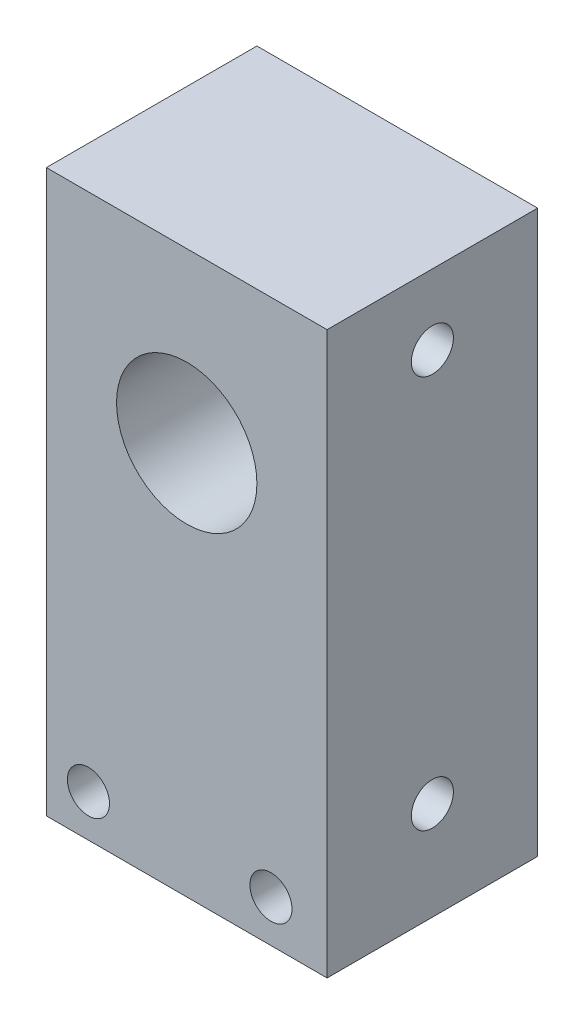
ISO-10303-21;
HEADER;
FILE_DESCRIPTION(('STEP AP214'),'2;1');
FILE_NAME('part.step','',(''),(''),'','','');
FILE_SCHEMA(('AUTOMOTIVE_DESIGN { 1 0 10303 214 1 1 1 1 }'));
ENDSEC;
DATA;
#1=APPLICATION_CONTEXT('core data for automotive mechanical design processes');
#2=APPLICATION_PROTOCOL_DEFINITION('international standard','automotive_design',2000,#1);
#3=PRODUCT_CONTEXT('',#1,'mechanical');
#4=PRODUCT('Part','Part','',(#3));
#5=PRODUCT_RELATED_PRODUCT_CATEGORY('part','',(#4));
#6=PRODUCT_DEFINITION_FORMATION('','',#4);
#7=PRODUCT_DEFINITION_CONTEXT('part definition',#1,'design');
#8=PRODUCT_DEFINITION('design','',#6,#7);
#9=PRODUCT_DEFINITION_SHAPE('','',#8);
#10=(LENGTH_UNIT() NAMED_UNIT(*) SI_UNIT(.MILLI.,.METRE.));
#11=(NAMED_UNIT(*) PLANE_ANGLE_UNIT() SI_UNIT($,.RADIAN.));
#12=(NAMED_UNIT(*) SI_UNIT($,.STERADIAN.) SOLID_ANGLE_UNIT());
#13=UNCERTAINTY_MEASURE_WITH_UNIT(LENGTH_MEASURE(1.E-05),#10,'distance_accuracy_value','');
#14=(GEOMETRIC_REPRESENTATION_CONTEXT(3) GLOBAL_UNCERTAINTY_ASSIGNED_CONTEXT((#13)) GLOBAL_UNIT_ASSIGNED_CONTEXT((#10,
#11,#12)) REPRESENTATION_CONTEXT('',''));
#15=CARTESIAN_POINT('',(0.,0.,0.));
#16=DIRECTION('',(0.,0.,1.));
#17=DIRECTION('',(1.,0.,0.));
#18=AXIS2_PLACEMENT_3D('',#15,#16,#17);
#19=CARTESIAN_POINT('',(0.,0.,15.));
#20=DIRECTION('',(1.,0.,0.));
#21=DIRECTION('',(0.,1.,0.));
#22=AXIS2_PLACEMENT_3D('',#19,#20,#21);
#23=PLANE('',#22);
#24=DIRECTION('',(0.,-1.,0.));
#25=VECTOR('',#24,1.);
#26=CARTESIAN_POINT('',(0.,0.,0.));
#27=LINE('',#26,#25);
#28=CARTESIAN_POINT('',(0.,40.,0.));
#29=VERTEX_POINT('',#28);
#30=CARTESIAN_POINT('',(0.,0.,0.));
#31=VERTEX_POINT('',#30);
#32=EDGE_CURVE('E121',#29,#31,#27,.T.);
#33=ORIENTED_EDGE('',*,*,#32,.T.);
#34=DIRECTION('',(0.,0.,-1.));
#35=VECTOR('',#34,1.);
#36=CARTESIAN_POINT('',(0.,0.,15.));
#37=LINE('',#36,#35);
#38=CARTESIAN_POINT('',(0.,0.,15.));
#39=VERTEX_POINT('',#38);
#40=EDGE_CURVE('E13',#39,#31,#37,.T.);
#41=ORIENTED_EDGE('',*,*,#40,.F.);
#42=DIRECTION('',(0.,-1.,0.));
#43=VECTOR('',#42,1.);
#44=CARTESIAN_POINT('',(0.,0.,15.));
#45=LINE('',#44,#43);
#46=CARTESIAN_POINT('',(0.,40.,15.));
#47=VERTEX_POINT('',#46);
#48=EDGE_CURVE('E104',#47,#39,#45,.T.);
#49=ORIENTED_EDGE('',*,*,#48,.F.);
#50=DIRECTION('',(0.,0.,-1.));
#51=VECTOR('',#50,1.);
#52=CARTESIAN_POINT('',(0.,40.,15.));
#53=LINE('',#52,#51);
#54=EDGE_CURVE('E117',#47,#29,#53,.T.);
#55=ORIENTED_EDGE('',*,*,#54,.T.);
#56=EDGE_LOOP('',(#33,#41,#49,#55));
#57=FACE_BOUND('',#56,.T.);
#58=ADVANCED_FACE('F52',(#57),#23,.F.);
#59=CARTESIAN_POINT('',(0.,0.,15.));
#60=DIRECTION('',(0.,1.,0.));
#61=DIRECTION('',(0.,0.,1.));
#62=AXIS2_PLACEMENT_3D('',#59,#60,#61);
#63=PLANE('',#62);
#64=DIRECTION('',(1.,0.,0.));
#65=VECTOR('',#64,1.);
#66=CARTESIAN_POINT('',(0.,0.,0.));
#67=LINE('',#66,#65);
#68=CARTESIAN_POINT('',(20.,0.,0.));
#69=VERTEX_POINT('',#68);
#70=EDGE_CURVE('E109',#31,#69,#67,.T.);
#71=ORIENTED_EDGE('',*,*,#70,.T.);
#72=DIRECTION('',(0.,0.,-1.));
#73=VECTOR('',#72,1.);
#74=CARTESIAN_POINT('',(20.,0.,15.));
#75=LINE('',#74,#73);
#76=CARTESIAN_POINT('',(20.,0.,15.));
#77=VERTEX_POINT('',#76);
#78=EDGE_CURVE('E61',#77,#69,#75,.T.);
#79=ORIENTED_EDGE('',*,*,#78,.F.);
#80=DIRECTION('',(1.,0.,0.));
#81=VECTOR('',#80,1.);
#82=CARTESIAN_POINT('',(0.,0.,15.));
#83=LINE('',#82,#81);
#84=EDGE_CURVE('E99',#39,#77,#83,.T.);
#85=ORIENTED_EDGE('',*,*,#84,.F.);
#86=ORIENTED_EDGE('',*,*,#40,.T.);
#87=EDGE_LOOP('',(#71,#79,#85,#86));
#88=FACE_BOUND('',#87,.T.);
#89=ADVANCED_FACE('F108',(#88),#63,.F.);
#90=CARTESIAN_POINT('',(20.,0.,15.));
#91=DIRECTION('',(-1.,0.,0.));
#92=DIRECTION('',(0.,-1.,0.));
#93=AXIS2_PLACEMENT_3D('',#90,#91,#92);
#94=PLANE('',#93);
#95=CARTESIAN_POINT('',(20.,35.,7.50000000000001));
#96=DIRECTION('',(1.,0.,0.));
#97=DIRECTION('',(0.,1.,0.));
#98=AXIS2_PLACEMENT_3D('',#95,#96,#97);
#99=CIRCLE('',#98,1.5);
#100=CARTESIAN_POINT('',(20.,36.5,7.50000000000001));
#101=VERTEX_POINT('',#100);
#102=EDGE_CURVE('E153',#101,#101,#99,.T.);
#103=ORIENTED_EDGE('',*,*,#102,.F.);
#104=EDGE_LOOP('',(#103));
#105=FACE_BOUND('',#104,.T.);
#106=CARTESIAN_POINT('',(19.9999999999999,7.00000000000001,7.50000000000001));
#107=DIRECTION('',(1.,0.,0.));
#108=DIRECTION('',(0.,1.,0.));
#109=AXIS2_PLACEMENT_3D('',#106,#107,#108);
#110=CIRCLE('',#109,1.5);
#111=CARTESIAN_POINT('',(19.9999999999999,8.50000000000001,7.50000000000001));
#112=VERTEX_POINT('',#111);
#113=EDGE_CURVE('E144',#112,#112,#110,.T.);
#114=ORIENTED_EDGE('',*,*,#113,.F.);
#115=EDGE_LOOP('',(#114));
#116=FACE_BOUND('',#115,.T.);
#117=DIRECTION('',(0.,1.,0.));
#118=VECTOR('',#117,1.);
#119=CARTESIAN_POINT('',(20.,0.,0.));
#120=LINE('',#119,#118);
#121=CARTESIAN_POINT('',(20.,40.,0.));
#122=VERTEX_POINT('',#121);
#123=EDGE_CURVE('E86',#69,#122,#120,.T.);
#124=ORIENTED_EDGE('',*,*,#123,.T.);
#125=DIRECTION('',(0.,0.,-1.));
#126=VECTOR('',#125,1.);
#127=CARTESIAN_POINT('',(20.,40.,15.));
#128=LINE('',#127,#126);
#129=CARTESIAN_POINT('',(20.,40.,15.));
#130=VERTEX_POINT('',#129);
#131=EDGE_CURVE('E111',#130,#122,#128,.T.);
#132=ORIENTED_EDGE('',*,*,#131,.F.);
#133=DIRECTION('',(0.,1.,0.));
#134=VECTOR('',#133,1.);
#135=CARTESIAN_POINT('',(20.,0.,15.));
#136=LINE('',#135,#134);
#137=EDGE_CURVE('E102',#77,#130,#136,.T.);
#138=ORIENTED_EDGE('',*,*,#137,.F.);
#139=ORIENTED_EDGE('',*,*,#78,.T.);
#140=EDGE_LOOP('',(#124,#132,#138,#139));
#141=FACE_BOUND('',#140,.T.);
#142=ADVANCED_FACE('F112',(#105,#116,#141),#94,.F.);
#143=CARTESIAN_POINT('',(0.,40.,15.));
#144=DIRECTION('',(0.,-1.,0.));
#145=DIRECTION('',(0.,0.,-1.));
#146=AXIS2_PLACEMENT_3D('',#143,#144,#145);
#147=PLANE('',#146);
#148=DIRECTION('',(-1.,0.,0.));
#149=VECTOR('',#148,1.);
#150=CARTESIAN_POINT('',(0.,40.,0.));
#151=LINE('',#150,#149);
#152=EDGE_CURVE('E92',#122,#29,#151,.T.);
#153=ORIENTED_EDGE('',*,*,#152,.T.);
#154=ORIENTED_EDGE('',*,*,#54,.F.);
#155=DIRECTION('',(-1.,0.,0.));
#156=VECTOR('',#155,1.);
#157=CARTESIAN_POINT('',(0.,40.,15.));
#158=LINE('',#157,#156);
#159=EDGE_CURVE('E69',#130,#47,#158,.T.);
#160=ORIENTED_EDGE('',*,*,#159,.F.);
#161=ORIENTED_EDGE('',*,*,#131,.T.);
#162=EDGE_LOOP('',(#153,#154,#160,#161));
#163=FACE_BOUND('',#162,.T.);
#164=ADVANCED_FACE('F136',(#163),#147,.F.);
#165=CARTESIAN_POINT('',(0.,0.,15.));
#166=DIRECTION('',(0.,0.,-1.));
#167=DIRECTION('',(-1.,0.,0.));
#168=AXIS2_PLACEMENT_3D('',#165,#166,#167);
#169=PLANE('',#168);
#170=CARTESIAN_POINT('',(9.99999999999998,28.,15.));
#171=DIRECTION('',(0.,0.,-1.));
#172=DIRECTION('',(-1.,0.,0.));
#173=AXIS2_PLACEMENT_3D('',#170,#171,#172);
#174=CIRCLE('',#173,5.);
#175=CARTESIAN_POINT('',(4.99999999999998,28.,15.));
#176=VERTEX_POINT('',#175);
#177=EDGE_CURVE('E165',#176,#176,#174,.T.);
#178=ORIENTED_EDGE('',*,*,#177,.T.);
#179=EDGE_LOOP('',(#178));
#180=FACE_BOUND('',#179,.T.);
#181=CARTESIAN_POINT('',(16.,3.,15.));
#182=DIRECTION('',(0.,0.,-1.));
#183=DIRECTION('',(-1.,0.,0.));
#184=AXIS2_PLACEMENT_3D('',#181,#182,#183);
#185=CIRCLE('',#184,1.5);
#186=CARTESIAN_POINT('',(14.5,3.,15.));
#187=VERTEX_POINT('',#186);
#188=EDGE_CURVE('E149',#187,#187,#185,.T.);
#189=ORIENTED_EDGE('',*,*,#188,.T.);
#190=EDGE_LOOP('',(#189));
#191=FACE_BOUND('',#190,.T.);
#192=CARTESIAN_POINT('',(3.,3.,15.));
#193=DIRECTION('',(0.,0.,-1.));
#194=DIRECTION('',(-1.,0.,0.));
#195=AXIS2_PLACEMENT_3D('',#192,#193,#194);
#196=CIRCLE('',#195,1.5);
#197=CARTESIAN_POINT('',(1.5,3.,15.));
#198=VERTEX_POINT('',#197);
#199=EDGE_CURVE('E164',#198,#198,#196,.T.);
#200=ORIENTED_EDGE('',*,*,#199,.T.);
#201=EDGE_LOOP('',(#200));
#202=FACE_BOUND('',#201,.T.);
#203=ORIENTED_EDGE('',*,*,#48,.T.);
#204=ORIENTED_EDGE('',*,*,#84,.T.);
#205=ORIENTED_EDGE('',*,*,#137,.T.);
#206=ORIENTED_EDGE('',*,*,#159,.T.);
#207=EDGE_LOOP('',(#203,#204,#205,#206));
#208=FACE_BOUND('',#207,.T.);
#209=ADVANCED_FACE('F100',(#180,#191,#202,#208),#169,.F.);
#210=CARTESIAN_POINT('',(0.,0.,0.));
#211=DIRECTION('',(0.,0.,-1.));
#212=DIRECTION('',(-1.,0.,0.));
#213=AXIS2_PLACEMENT_3D('',#210,#211,#212);
#214=PLANE('',#213);
#215=CARTESIAN_POINT('',(9.99999999999998,28.,0.));
#216=DIRECTION('',(0.,0.,-1.));
#217=DIRECTION('',(-1.,0.,0.));
#218=AXIS2_PLACEMENT_3D('',#215,#216,#217);
#219=CIRCLE('',#218,5.);
#220=CARTESIAN_POINT('',(4.99999999999998,28.,0.));
#221=VERTEX_POINT('',#220);
#222=EDGE_CURVE('E176',#221,#221,#219,.T.);
#223=ORIENTED_EDGE('',*,*,#222,.F.);
#224=EDGE_LOOP('',(#223));
#225=FACE_BOUND('',#224,.T.);
#226=CARTESIAN_POINT('',(16.,3.,0.));
#227=DIRECTION('',(0.,0.,-1.));
#228=DIRECTION('',(-1.,0.,0.));
#229=AXIS2_PLACEMENT_3D('',#226,#227,#228);
#230=CIRCLE('',#229,1.5);
#231=CARTESIAN_POINT('',(14.5,3.,0.));
#232=VERTEX_POINT('',#231);
#233=EDGE_CURVE('E169',#232,#232,#230,.T.);
#234=ORIENTED_EDGE('',*,*,#233,.F.);
#235=EDGE_LOOP('',(#234));
#236=FACE_BOUND('',#235,.T.);
#237=CARTESIAN_POINT('',(3.,3.,0.));
#238=DIRECTION('',(0.,0.,-1.));
#239=DIRECTION('',(-1.,0.,0.));
#240=AXIS2_PLACEMENT_3D('',#237,#238,#239);
#241=CIRCLE('',#240,1.5);
#242=CARTESIAN_POINT('',(1.5,3.,0.));
#243=VERTEX_POINT('',#242);
#244=EDGE_CURVE('E160',#243,#243,#241,.T.);
#245=ORIENTED_EDGE('',*,*,#244,.F.);
#246=EDGE_LOOP('',(#245));
#247=FACE_BOUND('',#246,.T.);
#248=ORIENTED_EDGE('',*,*,#32,.F.);
#249=ORIENTED_EDGE('',*,*,#152,.F.);
#250=ORIENTED_EDGE('',*,*,#123,.F.);
#251=ORIENTED_EDGE('',*,*,#70,.F.);
#252=EDGE_LOOP('',(#248,#249,#250,#251));
#253=FACE_BOUND('',#252,.T.);
#254=ADVANCED_FACE('F139',(#225,#236,#247,#253),#214,.T.);
#255=CARTESIAN_POINT('',(9.99999999999995,7.00000000000002,7.50000000000001));
#256=DIRECTION('',(1.,0.,0.));
#257=DIRECTION('',(0.,1.,0.));
#258=AXIS2_PLACEMENT_3D('',#255,#256,#257);
#259=CYLINDRICAL_SURFACE('',#258,1.5);
#260=CARTESIAN_POINT('',(9.99999999999995,7.00000000000002,7.50000000000001));
#261=DIRECTION('',(1.,0.,0.));
#262=DIRECTION('',(0.,1.,0.));
#263=AXIS2_PLACEMENT_3D('',#260,#261,#262);
#264=CIRCLE('',#263,1.5);
#265=CARTESIAN_POINT('',(9.99999999999995,8.50000000000002,7.50000000000001));
#266=VERTEX_POINT('',#265);
#267=EDGE_CURVE('E148',#266,#266,#264,.T.);
#268=ORIENTED_EDGE('',*,*,#267,.F.);
#269=EDGE_LOOP('',(#268));
#270=FACE_BOUND('',#269,.T.);
#271=ORIENTED_EDGE('',*,*,#113,.T.);
#272=EDGE_LOOP('',(#271));
#273=FACE_BOUND('',#272,.T.);
#274=ADVANCED_FACE('F196',(#270,#273),#259,.F.);
#275=CARTESIAN_POINT('',(9.99999999999995,7.00000000000002,7.50000000000001));
#276=DIRECTION('',(1.,0.,0.));
#277=DIRECTION('',(0.,1.,0.));
#278=AXIS2_PLACEMENT_3D('',#275,#276,#277);
#279=PLANE('',#278);
#280=ORIENTED_EDGE('',*,*,#267,.T.);
#281=EDGE_LOOP('',(#280));
#282=FACE_BOUND('',#281,.T.);
#283=ADVANCED_FACE('F233',(#282),#279,.T.);
#284=CARTESIAN_POINT('',(9.99999999999998,35.,7.50000000000001));
#285=DIRECTION('',(1.,0.,0.));
#286=DIRECTION('',(0.,1.,0.));
#287=AXIS2_PLACEMENT_3D('',#284,#285,#286);
#288=CYLINDRICAL_SURFACE('',#287,1.5);
#289=CARTESIAN_POINT('',(9.99999999999998,35.,7.50000000000001));
#290=DIRECTION('',(1.,0.,0.));
#291=DIRECTION('',(0.,1.,0.));
#292=AXIS2_PLACEMENT_3D('',#289,#290,#291);
#293=CIRCLE('',#292,1.5);
#294=CARTESIAN_POINT('',(9.99999999999998,36.5,7.50000000000001));
#295=VERTEX_POINT('',#294);
#296=EDGE_CURVE('E125',#295,#295,#293,.T.);
#297=ORIENTED_EDGE('',*,*,#296,.F.);
#298=EDGE_LOOP('',(#297));
#299=FACE_BOUND('',#298,.T.);
#300=ORIENTED_EDGE('',*,*,#102,.T.);
#301=EDGE_LOOP('',(#300));
#302=FACE_BOUND('',#301,.T.);
#303=ADVANCED_FACE('F213',(#299,#302),#288,.F.);
#304=CARTESIAN_POINT('',(9.99999999999998,35.,7.50000000000001));
#305=DIRECTION('',(1.,0.,0.));
#306=DIRECTION('',(0.,1.,0.));
#307=AXIS2_PLACEMENT_3D('',#304,#305,#306);
#308=PLANE('',#307);
#309=ORIENTED_EDGE('',*,*,#296,.T.);
#310=EDGE_LOOP('',(#309));
#311=FACE_BOUND('',#310,.T.);
#312=ADVANCED_FACE('F204',(#311),#308,.T.);
#313=CARTESIAN_POINT('',(3.,3.,15.));
#314=DIRECTION('',(0.,0.,-1.));
#315=DIRECTION('',(-1.,0.,0.));
#316=AXIS2_PLACEMENT_3D('',#313,#314,#315);
#317=CYLINDRICAL_SURFACE('',#316,1.5);
#318=ORIENTED_EDGE('',*,*,#199,.F.);
#319=EDGE_LOOP('',(#318));
#320=FACE_BOUND('',#319,.T.);
#321=ORIENTED_EDGE('',*,*,#244,.T.);
#322=EDGE_LOOP('',(#321));
#323=FACE_BOUND('',#322,.T.);
#324=ADVANCED_FACE('F202',(#320,#323),#317,.F.);
#325=CARTESIAN_POINT('',(16.,3.,15.));
#326=DIRECTION('',(0.,0.,-1.));
#327=DIRECTION('',(-1.,0.,0.));
#328=AXIS2_PLACEMENT_3D('',#325,#326,#327);
#329=CYLINDRICAL_SURFACE('',#328,1.5);
#330=ORIENTED_EDGE('',*,*,#188,.F.);
#331=EDGE_LOOP('',(#330));
#332=FACE_BOUND('',#331,.T.);
#333=ORIENTED_EDGE('',*,*,#233,.T.);
#334=EDGE_LOOP('',(#333));
#335=FACE_BOUND('',#334,.T.);
#336=ADVANCED_FACE('F190',(#332,#335),#329,.F.);
#337=CARTESIAN_POINT('',(9.99999999999998,28.,15.));
#338=DIRECTION('',(0.,0.,-1.));
#339=DIRECTION('',(-1.,0.,0.));
#340=AXIS2_PLACEMENT_3D('',#337,#338,#339);
#341=CYLINDRICAL_SURFACE('',#340,5.);
#342=ORIENTED_EDGE('',*,*,#177,.F.);
#343=EDGE_LOOP('',(#342));
#344=FACE_BOUND('',#343,.T.);
#345=ORIENTED_EDGE('',*,*,#222,.T.);
#346=EDGE_LOOP('',(#345));
#347=FACE_BOUND('',#346,.T.);
#348=ADVANCED_FACE('F187',(#344,#347),#341,.F.);
#349=CLOSED_SHELL('',(#58,#89,#142,#164,#209,#254,#274,#283,#303,#312,#324,#336,#348));
#350=MANIFOLD_SOLID_BREP('B2',#349);
#351=ADVANCED_BREP_SHAPE_REPRESENTATION('',(#18,#350),#14);
#352=SHAPE_DEFINITION_REPRESENTATION(#9,#351);
ENDSEC;
END-ISO-10303-21;
